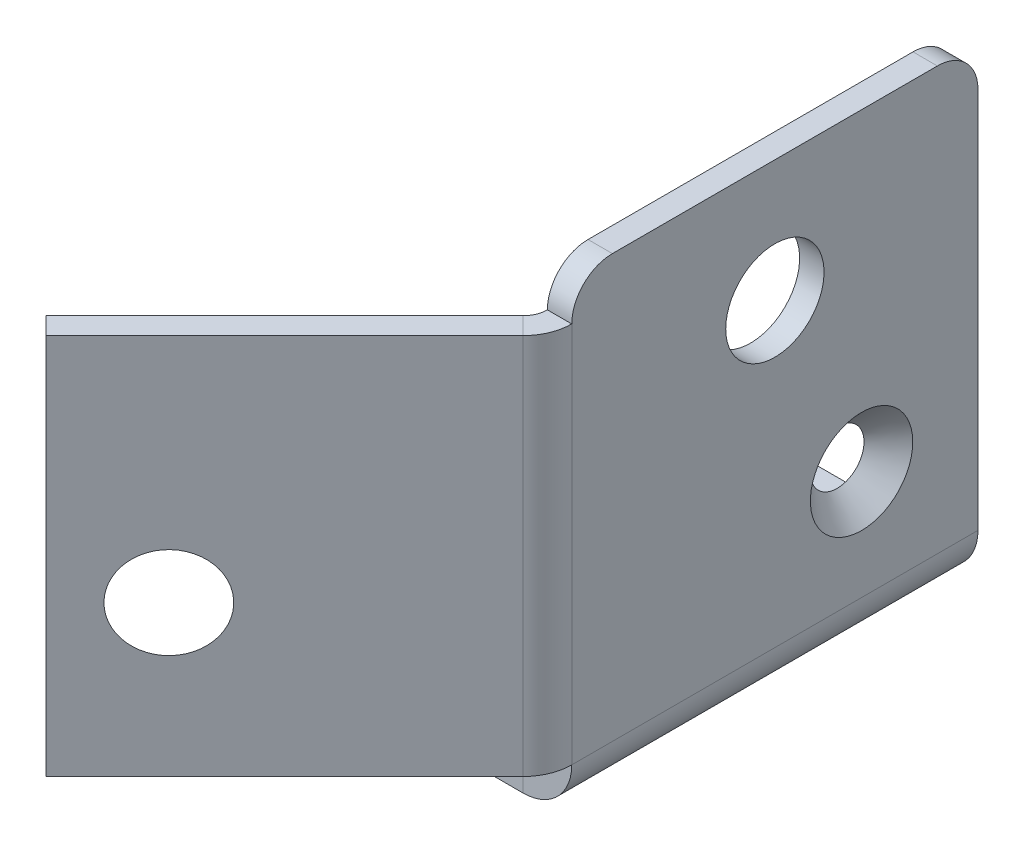
ISO-10303-21;
HEADER;
FILE_DESCRIPTION(('STEP AP214'),'2;1');
FILE_NAME('part.step','',(''),(''),'','','');
FILE_SCHEMA(('AUTOMOTIVE_DESIGN { 1 0 10303 214 1 1 1 1 }'));
ENDSEC;
DATA;
#1=APPLICATION_CONTEXT('core data for automotive mechanical design processes');
#2=APPLICATION_PROTOCOL_DEFINITION('international standard','automotive_design',2000,#1);
#3=PRODUCT_CONTEXT('',#1,'mechanical');
#4=PRODUCT('Part','Part','',(#3));
#5=PRODUCT_RELATED_PRODUCT_CATEGORY('part','',(#4));
#6=PRODUCT_DEFINITION_FORMATION('','',#4);
#7=PRODUCT_DEFINITION_CONTEXT('part definition',#1,'design');
#8=PRODUCT_DEFINITION('design','',#6,#7);
#9=PRODUCT_DEFINITION_SHAPE('','',#8);
#10=(LENGTH_UNIT() NAMED_UNIT(*) SI_UNIT(.MILLI.,.METRE.));
#11=(NAMED_UNIT(*) PLANE_ANGLE_UNIT() SI_UNIT($,.RADIAN.));
#12=(NAMED_UNIT(*) SI_UNIT($,.STERADIAN.) SOLID_ANGLE_UNIT());
#13=UNCERTAINTY_MEASURE_WITH_UNIT(LENGTH_MEASURE(1.E-05),#10,'distance_accuracy_value','');
#14=(GEOMETRIC_REPRESENTATION_CONTEXT(3) GLOBAL_UNCERTAINTY_ASSIGNED_CONTEXT((#13)) GLOBAL_UNIT_ASSIGNED_CONTEXT((#10,
#11,#12)) REPRESENTATION_CONTEXT('',''));
#15=CARTESIAN_POINT('',(0.,0.,0.));
#16=DIRECTION('',(0.,0.,1.));
#17=DIRECTION('',(1.,0.,0.));
#18=AXIS2_PLACEMENT_3D('',#15,#16,#17);
#19=CARTESIAN_POINT('',(0.,3.,50.));
#20=DIRECTION('',(0.,0.,1.));
#21=DIRECTION('',(1.,0.,0.));
#22=AXIS2_PLACEMENT_3D('',#19,#20,#21);
#23=PLANE('',#22);
#24=DIRECTION('',(1.,0.,0.));
#25=VECTOR('',#24,1.);
#26=CARTESIAN_POINT('',(0.,3.,50.));
#27=LINE('',#26,#25);
#28=CARTESIAN_POINT('',(0.,3.,50.));
#29=VERTEX_POINT('',#28);
#30=CARTESIAN_POINT('',(3.,3.,50.));
#31=VERTEX_POINT('',#30);
#32=EDGE_CURVE('E392',#29,#31,#27,.T.);
#33=ORIENTED_EDGE('',*,*,#32,.F.);
#34=CARTESIAN_POINT('',(-3.,3.,50.));
#35=DIRECTION('',(0.,0.,-1.));
#36=DIRECTION('',(-1.,0.,0.));
#37=AXIS2_PLACEMENT_3D('',#34,#35,#36);
#38=CIRCLE('',#37,3.);
#39=CARTESIAN_POINT('',(-3.,0.,50.));
#40=VERTEX_POINT('',#39);
#41=EDGE_CURVE('E318',#40,#29,#38,.F.);
#42=ORIENTED_EDGE('',*,*,#41,.F.);
#43=DIRECTION('',(0.,1.,0.));
#44=VECTOR('',#43,1.);
#45=CARTESIAN_POINT('',(-3.,-3.,50.));
#46=LINE('',#45,#44);
#47=CARTESIAN_POINT('',(-3.,-3.,50.));
#48=VERTEX_POINT('',#47);
#49=EDGE_CURVE('E388',#48,#40,#46,.T.);
#50=ORIENTED_EDGE('',*,*,#49,.F.);
#51=CARTESIAN_POINT('',(-3.,3.,50.));
#52=DIRECTION('',(0.,0.,1.));
#53=DIRECTION('',(1.,0.,0.));
#54=AXIS2_PLACEMENT_3D('',#51,#52,#53);
#55=CIRCLE('',#54,6.);
#56=EDGE_CURVE('E328',#48,#31,#55,.T.);
#57=ORIENTED_EDGE('',*,*,#56,.T.);
#58=EDGE_LOOP('',(#33,#42,#50,#57));
#59=FACE_BOUND('',#58,.T.);
#60=ADVANCED_FACE('F73',(#59),#23,.T.);
#61=CARTESIAN_POINT('',(-3.,0.,0.));
#62=DIRECTION('',(0.,0.,-1.));
#63=DIRECTION('',(-1.,0.,0.));
#64=AXIS2_PLACEMENT_3D('',#61,#62,#63);
#65=PLANE('',#64);
#66=DIRECTION('',(0.,-1.,0.));
#67=VECTOR('',#66,1.);
#68=CARTESIAN_POINT('',(-3.,0.,0.));
#69=LINE('',#68,#67);
#70=CARTESIAN_POINT('',(-3.,0.,0.));
#71=VERTEX_POINT('',#70);
#72=CARTESIAN_POINT('',(-3.,-3.,0.));
#73=VERTEX_POINT('',#72);
#74=EDGE_CURVE('E384',#71,#73,#69,.T.);
#75=ORIENTED_EDGE('',*,*,#74,.F.);
#76=CARTESIAN_POINT('',(-3.,3.,0.));
#77=DIRECTION('',(0.,0.,-1.));
#78=DIRECTION('',(-1.,0.,0.));
#79=AXIS2_PLACEMENT_3D('',#76,#77,#78);
#80=CIRCLE('',#79,3.);
#81=CARTESIAN_POINT('',(0.,3.,0.));
#82=VERTEX_POINT('',#81);
#83=EDGE_CURVE('E338',#71,#82,#80,.F.);
#84=ORIENTED_EDGE('',*,*,#83,.T.);
#85=DIRECTION('',(-1.,0.,0.));
#86=VECTOR('',#85,1.);
#87=CARTESIAN_POINT('',(3.,3.,0.));
#88=LINE('',#87,#86);
#89=CARTESIAN_POINT('',(3.,3.,0.));
#90=VERTEX_POINT('',#89);
#91=EDGE_CURVE('E381',#90,#82,#88,.T.);
#92=ORIENTED_EDGE('',*,*,#91,.F.);
#93=CARTESIAN_POINT('',(-3.,3.,0.));
#94=DIRECTION('',(0.,0.,1.));
#95=DIRECTION('',(1.,0.,0.));
#96=AXIS2_PLACEMENT_3D('',#93,#94,#95);
#97=CIRCLE('',#96,6.);
#98=EDGE_CURVE('E315',#73,#90,#97,.T.);
#99=ORIENTED_EDGE('',*,*,#98,.F.);
#100=EDGE_LOOP('',(#75,#84,#92,#99));
#101=FACE_BOUND('',#100,.T.);
#102=ADVANCED_FACE('F460',(#101),#65,.T.);
#103=CARTESIAN_POINT('',(3.,3.,0.));
#104=DIRECTION('',(0.,0.,-1.));
#105=DIRECTION('',(-1.,0.,0.));
#106=AXIS2_PLACEMENT_3D('',#103,#104,#105);
#107=PLANE('',#106);
#108=DIRECTION('',(1.,0.,0.));
#109=VECTOR('',#108,1.);
#110=CARTESIAN_POINT('',(0.,-3.,0.));
#111=LINE('',#110,#109);
#112=CARTESIAN_POINT('',(-25.,-3.,0.));
#113=VERTEX_POINT('',#112);
#114=EDGE_CURVE('E345',#113,#73,#111,.T.);
#115=ORIENTED_EDGE('',*,*,#114,.F.);
#116=DIRECTION('',(0.,1.,0.));
#117=VECTOR('',#116,1.);
#118=CARTESIAN_POINT('',(-25.,3.,0.));
#119=LINE('',#118,#117);
#120=CARTESIAN_POINT('',(-25.,0.,0.));
#121=VERTEX_POINT('',#120);
#122=EDGE_CURVE('E82',#113,#121,#119,.T.);
#123=ORIENTED_EDGE('',*,*,#122,.T.);
#124=DIRECTION('',(1.,0.,0.));
#125=VECTOR('',#124,1.);
#126=CARTESIAN_POINT('',(0.,0.,0.));
#127=LINE('',#126,#125);
#128=EDGE_CURVE('E342',#121,#71,#127,.T.);
#129=ORIENTED_EDGE('',*,*,#128,.T.);
#130=ORIENTED_EDGE('',*,*,#74,.T.);
#131=EDGE_LOOP('',(#115,#123,#129,#130));
#132=FACE_BOUND('',#131,.T.);
#133=ADVANCED_FACE('F446',(#132),#107,.T.);
#134=CARTESIAN_POINT('',(3.,0.,50.));
#135=DIRECTION('',(-1.,0.,0.));
#136=DIRECTION('',(0.,0.,1.));
#137=AXIS2_PLACEMENT_3D('',#134,#135,#136);
#138=PLANE('',#137);
#139=CARTESIAN_POINT('',(3.,16.4388147831113,14.3300473282855));
#140=DIRECTION('',(1.,0.,0.));
#141=DIRECTION('',(0.,0.,-1.));
#142=AXIS2_PLACEMENT_3D('',#139,#140,#141);
#143=CIRCLE('',#142,6.3);
#144=CARTESIAN_POINT('',(3.,16.4388147831113,8.03004732828552));
#145=VERTEX_POINT('',#144);
#146=EDGE_CURVE('E591',#145,#145,#143,.T.);
#147=ORIENTED_EDGE('',*,*,#146,.F.);
#148=EDGE_LOOP('',(#147));
#149=FACE_BOUND('',#148,.T.);
#150=CARTESIAN_POINT('',(3.,40.,25.));
#151=DIRECTION('',(-1.,0.,0.));
#152=DIRECTION('',(0.,0.,1.));
#153=AXIS2_PLACEMENT_3D('',#150,#151,#152);
#154=CIRCLE('',#153,6.04999999999999);
#155=CARTESIAN_POINT('',(3.,40.,31.05));
#156=VERTEX_POINT('',#155);
#157=EDGE_CURVE('E306',#156,#156,#154,.T.);
#158=ORIENTED_EDGE('',*,*,#157,.T.);
#159=EDGE_LOOP('',(#158));
#160=FACE_BOUND('',#159,.T.);
#161=DIRECTION('',(0.,0.,-1.));
#162=VECTOR('',#161,1.);
#163=CARTESIAN_POINT('',(3.,55.,50.));
#164=LINE('',#163,#162);
#165=CARTESIAN_POINT('',(3.,55.,45.));
#166=VERTEX_POINT('',#165);
#167=CARTESIAN_POINT('',(3.,55.,5.));
#168=VERTEX_POINT('',#167);
#169=EDGE_CURVE('E377',#166,#168,#164,.T.);
#170=ORIENTED_EDGE('',*,*,#169,.F.);
#171=CARTESIAN_POINT('',(3.,50.,45.));
#172=DIRECTION('',(-1.,0.,0.));
#173=DIRECTION('',(0.,0.,1.));
#174=AXIS2_PLACEMENT_3D('',#171,#172,#173);
#175=CIRCLE('',#174,5.);
#176=CARTESIAN_POINT('',(3.,50.,50.));
#177=VERTEX_POINT('',#176);
#178=EDGE_CURVE('E428',#166,#177,#175,.F.);
#179=ORIENTED_EDGE('',*,*,#178,.T.);
#180=DIRECTION('',(0.,1.,0.));
#181=VECTOR('',#180,1.);
#182=CARTESIAN_POINT('',(3.,0.,50.));
#183=LINE('',#182,#181);
#184=EDGE_CURVE('E311',#31,#177,#183,.T.);
#185=ORIENTED_EDGE('',*,*,#184,.F.);
#186=DIRECTION('',(0.,0.,-1.));
#187=VECTOR('',#186,1.);
#188=CARTESIAN_POINT('',(3.,3.,50.));
#189=LINE('',#188,#187);
#190=EDGE_CURVE('E331',#31,#90,#189,.T.);
#191=ORIENTED_EDGE('',*,*,#190,.T.);
#192=DIRECTION('',(0.,1.,0.));
#193=VECTOR('',#192,1.);
#194=CARTESIAN_POINT('',(3.,0.,0.));
#195=LINE('',#194,#193);
#196=CARTESIAN_POINT('',(3.,50.,0.));
#197=VERTEX_POINT('',#196);
#198=EDGE_CURVE('E310',#90,#197,#195,.T.);
#199=ORIENTED_EDGE('',*,*,#198,.T.);
#200=CARTESIAN_POINT('',(3.,50.,5.));
#201=DIRECTION('',(-1.,0.,0.));
#202=DIRECTION('',(0.,0.,1.));
#203=AXIS2_PLACEMENT_3D('',#200,#201,#202);
#204=CIRCLE('',#203,5.);
#205=EDGE_CURVE('E425',#197,#168,#204,.F.);
#206=ORIENTED_EDGE('',*,*,#205,.T.);
#207=EDGE_LOOP('',(#170,#179,#185,#191,#199,#206));
#208=FACE_BOUND('',#207,.T.);
#209=ADVANCED_FACE('F510',(#149,#160,#208),#138,.F.);
#210=CARTESIAN_POINT('',(0.,55.,50.));
#211=DIRECTION('',(0.,1.,0.));
#212=DIRECTION('',(0.,0.,1.));
#213=AXIS2_PLACEMENT_3D('',#210,#211,#212);
#214=PLANE('',#213);
#215=DIRECTION('',(0.,0.,-1.));
#216=VECTOR('',#215,1.);
#217=CARTESIAN_POINT('',(0.,55.,50.));
#218=LINE('',#217,#216);
#219=CARTESIAN_POINT('',(0.,55.,45.));
#220=VERTEX_POINT('',#219);
#221=CARTESIAN_POINT('',(0.,55.,5.));
#222=VERTEX_POINT('',#221);
#223=EDGE_CURVE('E374',#220,#222,#218,.T.);
#224=ORIENTED_EDGE('',*,*,#223,.F.);
#225=DIRECTION('',(1.,0.,0.));
#226=VECTOR('',#225,1.);
#227=CARTESIAN_POINT('',(0.,55.,45.));
#228=LINE('',#227,#226);
#229=EDGE_CURVE('E421',#220,#166,#228,.T.);
#230=ORIENTED_EDGE('',*,*,#229,.T.);
#231=ORIENTED_EDGE('',*,*,#169,.T.);
#232=DIRECTION('',(1.,0.,0.));
#233=VECTOR('',#232,1.);
#234=CARTESIAN_POINT('',(0.,55.,5.));
#235=LINE('',#234,#233);
#236=EDGE_CURVE('E418',#168,#222,#235,.F.);
#237=ORIENTED_EDGE('',*,*,#236,.T.);
#238=EDGE_LOOP('',(#224,#230,#231,#237));
#239=FACE_BOUND('',#238,.T.);
#240=ADVANCED_FACE('F513',(#239),#214,.T.);
#241=CARTESIAN_POINT('',(0.,0.,50.));
#242=DIRECTION('',(-1.,0.,0.));
#243=DIRECTION('',(0.,0.,1.));
#244=AXIS2_PLACEMENT_3D('',#241,#242,#243);
#245=PLANE('',#244);
#246=CARTESIAN_POINT('',(0.,16.4388147831113,14.3300473282855));
#247=DIRECTION('',(1.,0.,0.));
#248=DIRECTION('',(0.,0.,-1.));
#249=AXIS2_PLACEMENT_3D('',#246,#247,#248);
#250=CIRCLE('',#249,3.3);
#251=CARTESIAN_POINT('',(0.,16.4388147831113,11.0300473282855));
#252=VERTEX_POINT('',#251);
#253=EDGE_CURVE('E588',#252,#252,#250,.T.);
#254=ORIENTED_EDGE('',*,*,#253,.T.);
#255=EDGE_LOOP('',(#254));
#256=FACE_BOUND('',#255,.T.);
#257=CARTESIAN_POINT('',(0.,40.,25.));
#258=DIRECTION('',(-1.,0.,0.));
#259=DIRECTION('',(0.,0.,1.));
#260=AXIS2_PLACEMENT_3D('',#257,#258,#259);
#261=CIRCLE('',#260,6.05);
#262=CARTESIAN_POINT('',(0.,40.,31.05));
#263=VERTEX_POINT('',#262);
#264=EDGE_CURVE('E302',#263,#263,#261,.T.);
#265=ORIENTED_EDGE('',*,*,#264,.F.);
#266=EDGE_LOOP('',(#265));
#267=FACE_BOUND('',#266,.T.);
#268=DIRECTION('',(0.,1.,0.));
#269=VECTOR('',#268,1.);
#270=CARTESIAN_POINT('',(0.,0.,50.));
#271=LINE('',#270,#269);
#272=CARTESIAN_POINT('',(0.,50.,50.));
#273=VERTEX_POINT('',#272);
#274=EDGE_CURVE('E102',#29,#273,#271,.T.);
#275=ORIENTED_EDGE('',*,*,#274,.T.);
#276=CARTESIAN_POINT('',(0.,50.,45.));
#277=DIRECTION('',(-1.,0.,0.));
#278=DIRECTION('',(0.,0.,1.));
#279=AXIS2_PLACEMENT_3D('',#276,#277,#278);
#280=CIRCLE('',#279,5.);
#281=EDGE_CURVE('E438',#273,#220,#280,.T.);
#282=ORIENTED_EDGE('',*,*,#281,.T.);
#283=ORIENTED_EDGE('',*,*,#223,.T.);
#284=CARTESIAN_POINT('',(0.,50.,5.));
#285=DIRECTION('',(-1.,0.,0.));
#286=DIRECTION('',(0.,0.,1.));
#287=AXIS2_PLACEMENT_3D('',#284,#285,#286);
#288=CIRCLE('',#287,5.);
#289=CARTESIAN_POINT('',(0.,50.,0.));
#290=VERTEX_POINT('',#289);
#291=EDGE_CURVE('E92',#222,#290,#288,.T.);
#292=ORIENTED_EDGE('',*,*,#291,.T.);
#293=DIRECTION('',(0.,1.,0.));
#294=VECTOR('',#293,1.);
#295=CARTESIAN_POINT('',(0.,0.,0.));
#296=LINE('',#295,#294);
#297=EDGE_CURVE('E335',#82,#290,#296,.T.);
#298=ORIENTED_EDGE('',*,*,#297,.F.);
#299=DIRECTION('',(0.,0.,-1.));
#300=VECTOR('',#299,1.);
#301=CARTESIAN_POINT('',(0.,3.,50.));
#302=LINE('',#301,#300);
#303=EDGE_CURVE('E370',#29,#82,#302,.T.);
#304=ORIENTED_EDGE('',*,*,#303,.F.);
#305=EDGE_LOOP('',(#275,#282,#283,#292,#298,#304));
#306=FACE_BOUND('',#305,.T.);
#307=ADVANCED_FACE('F517',(#256,#267,#306),#245,.T.);
#308=CARTESIAN_POINT('',(-3.,3.,50.));
#309=DIRECTION('',(0.,0.,-1.));
#310=DIRECTION('',(-1.,0.,0.));
#311=AXIS2_PLACEMENT_3D('',#308,#309,#310);
#312=CYLINDRICAL_SURFACE('',#311,3.);
#313=ORIENTED_EDGE('',*,*,#83,.F.);
#314=DIRECTION('',(0.,0.,-1.));
#315=VECTOR('',#314,1.);
#316=CARTESIAN_POINT('',(-3.,0.,50.));
#317=LINE('',#316,#315);
#318=EDGE_CURVE('E366',#40,#71,#317,.T.);
#319=ORIENTED_EDGE('',*,*,#318,.F.);
#320=ORIENTED_EDGE('',*,*,#41,.T.);
#321=ORIENTED_EDGE('',*,*,#303,.T.);
#322=EDGE_LOOP('',(#313,#319,#320,#321));
#323=FACE_BOUND('',#322,.T.);
#324=ADVANCED_FACE('F458',(#323),#312,.F.);
#325=CARTESIAN_POINT('',(0.,0.,50.));
#326=DIRECTION('',(0.,1.,0.));
#327=DIRECTION('',(0.,0.,1.));
#328=AXIS2_PLACEMENT_3D('',#325,#326,#327);
#329=PLANE('',#328);
#330=CARTESIAN_POINT('',(-16.5,0.,40.));
#331=DIRECTION('',(0.,1.,0.));
#332=DIRECTION('',(0.,0.,1.));
#333=AXIS2_PLACEMENT_3D('',#330,#331,#332);
#334=CIRCLE('',#333,3.3);
#335=CARTESIAN_POINT('',(-16.5,0.,43.3));
#336=VERTEX_POINT('',#335);
#337=EDGE_CURVE('E274',#336,#336,#334,.T.);
#338=ORIENTED_EDGE('',*,*,#337,.F.);
#339=EDGE_LOOP('',(#338));
#340=FACE_BOUND('',#339,.T.);
#341=CARTESIAN_POINT('',(-16.5,0.,10.));
#342=DIRECTION('',(0.,1.,0.));
#343=DIRECTION('',(0.,0.,1.));
#344=AXIS2_PLACEMENT_3D('',#341,#342,#343);
#345=CIRCLE('',#344,3.3);
#346=CARTESIAN_POINT('',(-16.5,0.,13.3));
#347=VERTEX_POINT('',#346);
#348=EDGE_CURVE('E294',#347,#347,#345,.T.);
#349=ORIENTED_EDGE('',*,*,#348,.F.);
#350=EDGE_LOOP('',(#349));
#351=FACE_BOUND('',#350,.T.);
#352=DIRECTION('',(0.,0.,-1.));
#353=VECTOR('',#352,1.);
#354=CARTESIAN_POINT('',(-30.,0.,50.));
#355=LINE('',#354,#353);
#356=CARTESIAN_POINT('',(-30.,0.,45.));
#357=VERTEX_POINT('',#356);
#358=CARTESIAN_POINT('',(-30.,0.,5.));
#359=VERTEX_POINT('',#358);
#360=EDGE_CURVE('E362',#357,#359,#355,.T.);
#361=ORIENTED_EDGE('',*,*,#360,.F.);
#362=CARTESIAN_POINT('',(-25.,0.,45.));
#363=DIRECTION('',(0.,1.,0.));
#364=DIRECTION('',(0.,0.,1.));
#365=AXIS2_PLACEMENT_3D('',#362,#363,#364);
#366=CIRCLE('',#365,5.);
#367=CARTESIAN_POINT('',(-25.,0.,50.));
#368=VERTEX_POINT('',#367);
#369=EDGE_CURVE('E406',#357,#368,#366,.T.);
#370=ORIENTED_EDGE('',*,*,#369,.T.);
#371=DIRECTION('',(1.,0.,0.));
#372=VECTOR('',#371,1.);
#373=CARTESIAN_POINT('',(0.,0.,50.));
#374=LINE('',#373,#372);
#375=EDGE_CURVE('E322',#368,#40,#374,.T.);
#376=ORIENTED_EDGE('',*,*,#375,.T.);
#377=ORIENTED_EDGE('',*,*,#318,.T.);
#378=ORIENTED_EDGE('',*,*,#128,.F.);
#379=CARTESIAN_POINT('',(-25.,0.,5.));
#380=DIRECTION('',(0.,1.,0.));
#381=DIRECTION('',(0.,0.,1.));
#382=AXIS2_PLACEMENT_3D('',#379,#380,#381);
#383=CIRCLE('',#382,5.);
#384=EDGE_CURVE('E403',#121,#359,#383,.T.);
#385=ORIENTED_EDGE('',*,*,#384,.T.);
#386=EDGE_LOOP('',(#361,#370,#376,#377,#378,#385));
#387=FACE_BOUND('',#386,.T.);
#388=ADVANCED_FACE('F452',(#340,#351,#387),#329,.T.);
#389=CARTESIAN_POINT('',(-30.,-3.,50.));
#390=DIRECTION('',(-1.,0.,0.));
#391=DIRECTION('',(0.,0.,1.));
#392=AXIS2_PLACEMENT_3D('',#389,#390,#391);
#393=PLANE('',#392);
#394=DIRECTION('',(0.,0.,-1.));
#395=VECTOR('',#394,1.);
#396=CARTESIAN_POINT('',(-30.,-3.,50.));
#397=LINE('',#396,#395);
#398=CARTESIAN_POINT('',(-30.,-3.,45.));
#399=VERTEX_POINT('',#398);
#400=CARTESIAN_POINT('',(-30.,-3.,5.));
#401=VERTEX_POINT('',#400);
#402=EDGE_CURVE('E358',#399,#401,#397,.T.);
#403=ORIENTED_EDGE('',*,*,#402,.F.);
#404=DIRECTION('',(0.,1.,0.));
#405=VECTOR('',#404,1.);
#406=CARTESIAN_POINT('',(-30.,0.,45.));
#407=LINE('',#406,#405);
#408=EDGE_CURVE('E399',#399,#357,#407,.T.);
#409=ORIENTED_EDGE('',*,*,#408,.T.);
#410=ORIENTED_EDGE('',*,*,#360,.T.);
#411=DIRECTION('',(0.,1.,0.));
#412=VECTOR('',#411,1.);
#413=CARTESIAN_POINT('',(-30.,-3.,5.));
#414=LINE('',#413,#412);
#415=EDGE_CURVE('E396',#359,#401,#414,.F.);
#416=ORIENTED_EDGE('',*,*,#415,.T.);
#417=EDGE_LOOP('',(#403,#409,#410,#416));
#418=FACE_BOUND('',#417,.T.);
#419=ADVANCED_FACE('F475',(#418),#393,.T.);
#420=CARTESIAN_POINT('',(0.,-3.,50.));
#421=DIRECTION('',(0.,1.,0.));
#422=DIRECTION('',(0.,0.,1.));
#423=AXIS2_PLACEMENT_3D('',#420,#421,#422);
#424=PLANE('',#423);
#425=CARTESIAN_POINT('',(-16.5,-3.,40.));
#426=DIRECTION('',(0.,1.,0.));
#427=DIRECTION('',(0.,0.,1.));
#428=AXIS2_PLACEMENT_3D('',#425,#426,#427);
#429=CIRCLE('',#428,3.3);
#430=CARTESIAN_POINT('',(-16.5,-3.,43.3));
#431=VERTEX_POINT('',#430);
#432=EDGE_CURVE('E290',#431,#431,#429,.T.);
#433=ORIENTED_EDGE('',*,*,#432,.T.);
#434=EDGE_LOOP('',(#433));
#435=FACE_BOUND('',#434,.T.);
#436=CARTESIAN_POINT('',(-16.5,-3.,10.));
#437=DIRECTION('',(0.,1.,0.));
#438=DIRECTION('',(0.,0.,1.));
#439=AXIS2_PLACEMENT_3D('',#436,#437,#438);
#440=CIRCLE('',#439,3.3);
#441=CARTESIAN_POINT('',(-16.5,-3.,13.3));
#442=VERTEX_POINT('',#441);
#443=EDGE_CURVE('E298',#442,#442,#440,.T.);
#444=ORIENTED_EDGE('',*,*,#443,.T.);
#445=EDGE_LOOP('',(#444));
#446=FACE_BOUND('',#445,.T.);
#447=DIRECTION('',(1.,0.,0.));
#448=VECTOR('',#447,1.);
#449=CARTESIAN_POINT('',(0.,-3.,50.));
#450=LINE('',#449,#448);
#451=CARTESIAN_POINT('',(-25.,-3.,50.));
#452=VERTEX_POINT('',#451);
#453=EDGE_CURVE('E325',#452,#48,#450,.T.);
#454=ORIENTED_EDGE('',*,*,#453,.F.);
#455=CARTESIAN_POINT('',(-25.,-3.,45.));
#456=DIRECTION('',(0.,1.,0.));
#457=DIRECTION('',(0.,0.,1.));
#458=AXIS2_PLACEMENT_3D('',#455,#456,#457);
#459=CIRCLE('',#458,5.);
#460=EDGE_CURVE('E415',#452,#399,#459,.F.);
#461=ORIENTED_EDGE('',*,*,#460,.T.);
#462=ORIENTED_EDGE('',*,*,#402,.T.);
#463=CARTESIAN_POINT('',(-25.,-3.,5.));
#464=DIRECTION('',(0.,1.,0.));
#465=DIRECTION('',(0.,0.,1.));
#466=AXIS2_PLACEMENT_3D('',#463,#464,#465);
#467=CIRCLE('',#466,5.);
#468=EDGE_CURVE('E412',#401,#113,#467,.F.);
#469=ORIENTED_EDGE('',*,*,#468,.T.);
#470=ORIENTED_EDGE('',*,*,#114,.T.);
#471=DIRECTION('',(0.,0.,-1.));
#472=VECTOR('',#471,1.);
#473=CARTESIAN_POINT('',(-3.,-3.,50.));
#474=LINE('',#473,#472);
#475=EDGE_CURVE('E354',#48,#73,#474,.T.);
#476=ORIENTED_EDGE('',*,*,#475,.F.);
#477=EDGE_LOOP('',(#454,#461,#462,#469,#470,#476));
#478=FACE_BOUND('',#477,.T.);
#479=ADVANCED_FACE('F469',(#435,#446,#478),#424,.F.);
#480=CARTESIAN_POINT('',(-3.,3.,50.));
#481=DIRECTION('',(0.,0.,-1.));
#482=DIRECTION('',(-1.,0.,0.));
#483=AXIS2_PLACEMENT_3D('',#480,#481,#482);
#484=CYLINDRICAL_SURFACE('',#483,6.);
#485=ORIENTED_EDGE('',*,*,#98,.T.);
#486=ORIENTED_EDGE('',*,*,#190,.F.);
#487=ORIENTED_EDGE('',*,*,#56,.F.);
#488=ORIENTED_EDGE('',*,*,#475,.T.);
#489=EDGE_LOOP('',(#485,#486,#487,#488));
#490=FACE_BOUND('',#489,.T.);
#491=ADVANCED_FACE('F465',(#490),#484,.T.);
#492=CARTESIAN_POINT('',(-3.,3.,50.));
#493=DIRECTION('',(0.,0.,-1.));
#494=DIRECTION('',(-1.,0.,0.));
#495=AXIS2_PLACEMENT_3D('',#492,#493,#494);
#496=PLANE('',#495);
#497=ORIENTED_EDGE('',*,*,#375,.F.);
#498=DIRECTION('',(0.,1.,0.));
#499=VECTOR('',#498,1.);
#500=CARTESIAN_POINT('',(-25.,-3.,50.));
#501=LINE('',#500,#499);
#502=EDGE_CURVE('E409',#368,#452,#501,.F.);
#503=ORIENTED_EDGE('',*,*,#502,.T.);
#504=ORIENTED_EDGE('',*,*,#453,.T.);
#505=ORIENTED_EDGE('',*,*,#49,.T.);
#506=EDGE_LOOP('',(#497,#503,#504,#505));
#507=FACE_BOUND('',#506,.T.);
#508=ADVANCED_FACE('F480',(#507),#496,.F.);
#509=CARTESIAN_POINT('',(-3.,3.,0.));
#510=DIRECTION('',(0.,0.,-1.));
#511=DIRECTION('',(-1.,0.,0.));
#512=AXIS2_PLACEMENT_3D('',#509,#510,#511);
#513=PLANE('',#512);
#514=ORIENTED_EDGE('',*,*,#297,.T.);
#515=DIRECTION('',(1.,0.,0.));
#516=VECTOR('',#515,1.);
#517=CARTESIAN_POINT('',(-3.,50.,0.));
#518=LINE('',#517,#516);
#519=EDGE_CURVE('E13',#290,#197,#518,.T.);
#520=ORIENTED_EDGE('',*,*,#519,.T.);
#521=ORIENTED_EDGE('',*,*,#198,.F.);
#522=ORIENTED_EDGE('',*,*,#91,.T.);
#523=EDGE_LOOP('',(#514,#520,#521,#522));
#524=FACE_BOUND('',#523,.T.);
#525=ADVANCED_FACE('F533',(#524),#513,.T.);
#526=CARTESIAN_POINT('',(0.,40.,25.));
#527=DIRECTION('',(-1.,0.,0.));
#528=DIRECTION('',(0.,0.,1.));
#529=AXIS2_PLACEMENT_3D('',#526,#527,#528);
#530=CYLINDRICAL_SURFACE('',#529,6.05);
#531=ORIENTED_EDGE('',*,*,#157,.F.);
#532=EDGE_LOOP('',(#531));
#533=FACE_BOUND('',#532,.T.);
#534=ORIENTED_EDGE('',*,*,#264,.T.);
#535=EDGE_LOOP('',(#534));
#536=FACE_BOUND('',#535,.T.);
#537=ADVANCED_FACE('F535',(#533,#536),#530,.F.);
#538=CARTESIAN_POINT('',(-16.5,0.,10.));
#539=DIRECTION('',(0.,1.,0.));
#540=DIRECTION('',(0.,0.,1.));
#541=AXIS2_PLACEMENT_3D('',#538,#539,#540);
#542=CYLINDRICAL_SURFACE('',#541,3.3);
#543=ORIENTED_EDGE('',*,*,#443,.F.);
#544=EDGE_LOOP('',(#543));
#545=FACE_BOUND('',#544,.T.);
#546=ORIENTED_EDGE('',*,*,#348,.T.);
#547=EDGE_LOOP('',(#546));
#548=FACE_BOUND('',#547,.T.);
#549=ADVANCED_FACE('F495',(#545,#548),#542,.F.);
#550=CARTESIAN_POINT('',(-16.5,0.,40.));
#551=DIRECTION('',(0.,1.,0.));
#552=DIRECTION('',(0.,0.,1.));
#553=AXIS2_PLACEMENT_3D('',#550,#551,#552);
#554=CYLINDRICAL_SURFACE('',#553,3.3);
#555=ORIENTED_EDGE('',*,*,#432,.F.);
#556=EDGE_LOOP('',(#555));
#557=FACE_BOUND('',#556,.T.);
#558=ORIENTED_EDGE('',*,*,#337,.T.);
#559=EDGE_LOOP('',(#558));
#560=FACE_BOUND('',#559,.T.);
#561=ADVANCED_FACE('F485',(#557,#560),#554,.F.);
#562=CARTESIAN_POINT('',(-25.,-3.,45.));
#563=DIRECTION('',(0.,-1.,0.));
#564=DIRECTION('',(0.,0.,-1.));
#565=AXIS2_PLACEMENT_3D('',#562,#563,#564);
#566=CYLINDRICAL_SURFACE('',#565,5.);
#567=ORIENTED_EDGE('',*,*,#460,.F.);
#568=ORIENTED_EDGE('',*,*,#502,.F.);
#569=ORIENTED_EDGE('',*,*,#369,.F.);
#570=ORIENTED_EDGE('',*,*,#408,.F.);
#571=EDGE_LOOP('',(#567,#568,#569,#570));
#572=FACE_BOUND('',#571,.T.);
#573=ADVANCED_FACE('F482',(#572),#566,.T.);
#574=CARTESIAN_POINT('',(0.,50.,45.));
#575=DIRECTION('',(1.,0.,0.));
#576=DIRECTION('',(0.,0.,-1.));
#577=AXIS2_PLACEMENT_3D('',#574,#575,#576);
#578=CYLINDRICAL_SURFACE('',#577,5.);
#579=ORIENTED_EDGE('',*,*,#281,.F.);
#580=DIRECTION('',(1.,0.,0.));
#581=VECTOR('',#580,1.);
#582=CARTESIAN_POINT('',(-3.,50.,50.));
#583=LINE('',#582,#581);
#584=EDGE_CURVE('E432',#177,#273,#583,.F.);
#585=ORIENTED_EDGE('',*,*,#584,.F.);
#586=ORIENTED_EDGE('',*,*,#178,.F.);
#587=ORIENTED_EDGE('',*,*,#229,.F.);
#588=EDGE_LOOP('',(#579,#585,#586,#587));
#589=FACE_BOUND('',#588,.T.);
#590=ADVANCED_FACE('F484',(#589),#578,.T.);
#591=CARTESIAN_POINT('',(-25.,3.,5.));
#592=DIRECTION('',(0.,1.,0.));
#593=DIRECTION('',(0.,0.,1.));
#594=AXIS2_PLACEMENT_3D('',#591,#592,#593);
#595=CYLINDRICAL_SURFACE('',#594,5.);
#596=ORIENTED_EDGE('',*,*,#468,.F.);
#597=ORIENTED_EDGE('',*,*,#415,.F.);
#598=ORIENTED_EDGE('',*,*,#384,.F.);
#599=ORIENTED_EDGE('',*,*,#122,.F.);
#600=EDGE_LOOP('',(#596,#597,#598,#599));
#601=FACE_BOUND('',#600,.T.);
#602=ADVANCED_FACE('F473',(#601),#595,.T.);
#603=CARTESIAN_POINT('',(-3.,50.,5.));
#604=DIRECTION('',(1.,0.,0.));
#605=DIRECTION('',(0.,0.,-1.));
#606=AXIS2_PLACEMENT_3D('',#603,#604,#605);
#607=CYLINDRICAL_SURFACE('',#606,5.);
#608=ORIENTED_EDGE('',*,*,#291,.F.);
#609=ORIENTED_EDGE('',*,*,#236,.F.);
#610=ORIENTED_EDGE('',*,*,#205,.F.);
#611=ORIENTED_EDGE('',*,*,#519,.F.);
#612=EDGE_LOOP('',(#608,#609,#610,#611));
#613=FACE_BOUND('',#612,.T.);
#614=ADVANCED_FACE('F75',(#613),#607,.T.);
#615=CARTESIAN_POINT('',(-3.00000000000001,3.00000000000001,50.));
#616=DIRECTION('',(0.,-1.,0.));
#617=DIRECTION('',(1.,0.,0.));
#618=AXIS2_PLACEMENT_3D('',#615,#616,#617);
#619=PLANE('',#618);
#620=DIRECTION('',(-0.707106781186551,0.,-0.707106781186544));
#621=VECTOR('',#620,1.);
#622=CARTESIAN_POINT('',(1.24264068711931,3.,54.2426406871193));
#623=LINE('',#622,#621);
#624=CARTESIAN_POINT('',(-0.878679656440354,3.00000000000001,52.1213203435596));
#625=VERTEX_POINT('',#624);
#626=CARTESIAN_POINT('',(1.2426406871193,3.00000000000002,54.2426406871193));
#627=VERTEX_POINT('',#626);
#628=EDGE_CURVE('E243',#625,#627,#623,.F.);
#629=ORIENTED_EDGE('',*,*,#628,.F.);
#630=CARTESIAN_POINT('',(-3.00000000000001,3.00000000000001,50.));
#631=DIRECTION('',(0.,1.,0.));
#632=DIRECTION('',(-1.,0.,0.));
#633=AXIS2_PLACEMENT_3D('',#630,#631,#632);
#634=CIRCLE('',#633,3.);
#635=EDGE_CURVE('E279',#29,#625,#634,.F.);
#636=ORIENTED_EDGE('',*,*,#635,.F.);
#637=ORIENTED_EDGE('',*,*,#32,.T.);
#638=CARTESIAN_POINT('',(-3.00000000000001,3.00000000000002,50.));
#639=DIRECTION('',(0.,1.,0.));
#640=DIRECTION('',(-1.,0.,0.));
#641=AXIS2_PLACEMENT_3D('',#638,#639,#640);
#642=CIRCLE('',#641,6.);
#643=EDGE_CURVE('E270',#31,#627,#642,.F.);
#644=ORIENTED_EDGE('',*,*,#643,.T.);
#645=EDGE_LOOP('',(#629,#636,#637,#644));
#646=FACE_BOUND('',#645,.T.);
#647=ADVANCED_FACE('F549',(#646),#619,.T.);
#648=CARTESIAN_POINT('',(-3.,50.,50.));
#649=DIRECTION('',(0.,-1.,0.));
#650=DIRECTION('',(1.,0.,0.));
#651=AXIS2_PLACEMENT_3D('',#648,#649,#650);
#652=PLANE('',#651);
#653=CARTESIAN_POINT('',(-3.,50.,50.));
#654=DIRECTION('',(0.,1.,0.));
#655=DIRECTION('',(-1.,0.,0.));
#656=AXIS2_PLACEMENT_3D('',#653,#654,#655);
#657=CIRCLE('',#656,3.);
#658=CARTESIAN_POINT('',(-0.878679656440347,50.,52.1213203435596));
#659=VERTEX_POINT('',#658);
#660=EDGE_CURVE('E283',#659,#273,#657,.T.);
#661=ORIENTED_EDGE('',*,*,#660,.F.);
#662=DIRECTION('',(-0.707106781186551,0.,-0.707106781186544));
#663=VECTOR('',#662,1.);
#664=CARTESIAN_POINT('',(-0.878679656440347,50.,52.1213203435596));
#665=LINE('',#664,#663);
#666=CARTESIAN_POINT('',(1.2426406871193,50.,54.2426406871193));
#667=VERTEX_POINT('',#666);
#668=EDGE_CURVE('E260',#659,#667,#665,.F.);
#669=ORIENTED_EDGE('',*,*,#668,.T.);
#670=CARTESIAN_POINT('',(-3.,50.,50.));
#671=DIRECTION('',(0.,1.,0.));
#672=DIRECTION('',(-1.,0.,0.));
#673=AXIS2_PLACEMENT_3D('',#670,#671,#672);
#674=CIRCLE('',#673,6.);
#675=EDGE_CURVE('E275',#667,#177,#674,.T.);
#676=ORIENTED_EDGE('',*,*,#675,.T.);
#677=ORIENTED_EDGE('',*,*,#584,.T.);
#678=EDGE_LOOP('',(#661,#669,#676,#677));
#679=FACE_BOUND('',#678,.T.);
#680=ADVANCED_FACE('F545',(#679),#652,.F.);
#681=CARTESIAN_POINT('',(-3.,50.,50.));
#682=DIRECTION('',(0.,1.,0.));
#683=DIRECTION('',(0.707106781186551,0.,0.707106781186544));
#684=AXIS2_PLACEMENT_3D('',#681,#682,#683);
#685=CYLINDRICAL_SURFACE('',#684,6.);
#686=ORIENTED_EDGE('',*,*,#184,.T.);
#687=ORIENTED_EDGE('',*,*,#675,.F.);
#688=DIRECTION('',(0.,1.,0.));
#689=VECTOR('',#688,1.);
#690=CARTESIAN_POINT('',(1.2426406871193,3.,54.2426406871193));
#691=LINE('',#690,#689);
#692=EDGE_CURVE('E257',#667,#627,#691,.F.);
#693=ORIENTED_EDGE('',*,*,#692,.T.);
#694=ORIENTED_EDGE('',*,*,#643,.F.);
#695=EDGE_LOOP('',(#686,#687,#693,#694));
#696=FACE_BOUND('',#695,.T.);
#697=ADVANCED_FACE('F548',(#696),#685,.T.);
#698=CARTESIAN_POINT('',(-3.,50.,50.));
#699=DIRECTION('',(0.,1.,0.));
#700=DIRECTION('',(0.707106781186551,0.,0.707106781186544));
#701=AXIS2_PLACEMENT_3D('',#698,#699,#700);
#702=CYLINDRICAL_SURFACE('',#701,3.);
#703=ORIENTED_EDGE('',*,*,#274,.F.);
#704=ORIENTED_EDGE('',*,*,#635,.T.);
#705=DIRECTION('',(0.,1.,0.));
#706=VECTOR('',#705,1.);
#707=CARTESIAN_POINT('',(-0.878679656440352,3.,52.1213203435596));
#708=LINE('',#707,#706);
#709=EDGE_CURVE('E264',#625,#659,#708,.T.);
#710=ORIENTED_EDGE('',*,*,#709,.T.);
#711=ORIENTED_EDGE('',*,*,#660,.T.);
#712=EDGE_LOOP('',(#703,#704,#710,#711));
#713=FACE_BOUND('',#712,.T.);
#714=ADVANCED_FACE('F554',(#713),#702,.F.);
#715=CARTESIAN_POINT('',(2.12132034355965,3.,53.3639610306789));
#716=DIRECTION('',(0.,1.,0.));
#717=DIRECTION('',(0.,0.,1.));
#718=AXIS2_PLACEMENT_3D('',#715,#716,#717);
#719=PLANE('',#718);
#720=ORIENTED_EDGE('',*,*,#628,.T.);
#721=DIRECTION('',(0.707106781186544,0.,-0.707106781186551));
#722=VECTOR('',#721,1.);
#723=CARTESIAN_POINT('',(27.1213203435596,3.,28.3639610306786));
#724=LINE('',#723,#722);
#725=CARTESIAN_POINT('',(-28.1126983722079,3.,83.5979797464468));
#726=VERTEX_POINT('',#725);
#727=EDGE_CURVE('E222',#726,#627,#724,.T.);
#728=ORIENTED_EDGE('',*,*,#727,.F.);
#729=DIRECTION('',(-0.707106781186551,0.,-0.707106781186544));
#730=VECTOR('',#729,1.);
#731=CARTESIAN_POINT('',(-28.1126983722079,3.,83.5979797464468));
#732=LINE('',#731,#730);
#733=CARTESIAN_POINT('',(-30.2340187157676,3.,81.4766594028872));
#734=VERTEX_POINT('',#733);
#735=EDGE_CURVE('E229',#726,#734,#732,.T.);
#736=ORIENTED_EDGE('',*,*,#735,.T.);
#737=DIRECTION('',(-0.707106781186544,0.,0.707106781186551));
#738=VECTOR('',#737,1.);
#739=CARTESIAN_POINT('',(0.,3.,51.2426406871193));
#740=LINE('',#739,#738);
#741=EDGE_CURVE('E254',#734,#625,#740,.F.);
#742=ORIENTED_EDGE('',*,*,#741,.T.);
#743=EDGE_LOOP('',(#720,#728,#736,#742));
#744=FACE_BOUND('',#743,.T.);
#745=ADVANCED_FACE('F242',(#744),#719,.F.);
#746=CARTESIAN_POINT('',(-28.1126983722079,50.,83.5979797464468));
#747=DIRECTION('',(0.,-1.,0.));
#748=DIRECTION('',(0.,0.,-1.));
#749=AXIS2_PLACEMENT_3D('',#746,#747,#748);
#750=PLANE('',#749);
#751=ORIENTED_EDGE('',*,*,#668,.F.);
#752=DIRECTION('',(0.707106781186544,0.,-0.707106781186551));
#753=VECTOR('',#752,1.);
#754=CARTESIAN_POINT('',(-30.2340187157676,50.,81.4766594028872));
#755=LINE('',#754,#753);
#756=CARTESIAN_POINT('',(-30.2340187157676,50.,81.4766594028872));
#757=VERTEX_POINT('',#756);
#758=EDGE_CURVE('E249',#659,#757,#755,.F.);
#759=ORIENTED_EDGE('',*,*,#758,.T.);
#760=DIRECTION('',(-0.707106781186551,0.,-0.707106781186544));
#761=VECTOR('',#760,1.);
#762=CARTESIAN_POINT('',(-28.1126983722079,50.,83.5979797464468));
#763=LINE('',#762,#761);
#764=CARTESIAN_POINT('',(-28.1126983722079,50.,83.5979797464468));
#765=VERTEX_POINT('',#764);
#766=EDGE_CURVE('E239',#765,#757,#763,.T.);
#767=ORIENTED_EDGE('',*,*,#766,.F.);
#768=DIRECTION('',(-0.707106781186544,0.,0.707106781186551));
#769=VECTOR('',#768,1.);
#770=CARTESIAN_POINT('',(27.1213203435596,50.,28.3639610306786));
#771=LINE('',#770,#769);
#772=EDGE_CURVE('E224',#667,#765,#771,.T.);
#773=ORIENTED_EDGE('',*,*,#772,.F.);
#774=EDGE_LOOP('',(#751,#759,#767,#773));
#775=FACE_BOUND('',#774,.T.);
#776=ADVANCED_FACE('F563',(#775),#750,.F.);
#777=CARTESIAN_POINT('',(27.1213203435596,0.,28.3639610306786));
#778=DIRECTION('',(-0.707106781186551,0.,-0.707106781186544));
#779=DIRECTION('',(-0.707106781186544,0.,0.707106781186551));
#780=AXIS2_PLACEMENT_3D('',#777,#778,#779);
#781=PLANE('',#780);
#782=CARTESIAN_POINT('',(-20.5527123390871,21.5373545571103,76.0379937133259));
#783=DIRECTION('',(-0.707106781186551,0.,-0.707106781186544));
#784=DIRECTION('',(-0.707106781186544,0.,0.707106781186551));
#785=AXIS2_PLACEMENT_3D('',#782,#783,#784);
#786=CIRCLE('',#785,5.65);
#787=CARTESIAN_POINT('',(-24.5478656527911,21.5373545571103,80.0331470270299));
#788=VERTEX_POINT('',#787);
#789=EDGE_CURVE('E269',#788,#788,#786,.T.);
#790=ORIENTED_EDGE('',*,*,#789,.T.);
#791=EDGE_LOOP('',(#790));
#792=FACE_BOUND('',#791,.T.);
#793=ORIENTED_EDGE('',*,*,#692,.F.);
#794=ORIENTED_EDGE('',*,*,#772,.T.);
#795=DIRECTION('',(0.,-1.,0.));
#796=VECTOR('',#795,1.);
#797=CARTESIAN_POINT('',(-28.1126983722079,0.,83.5979797464468));
#798=LINE('',#797,#796);
#799=EDGE_CURVE('E217',#765,#726,#798,.T.);
#800=ORIENTED_EDGE('',*,*,#799,.T.);
#801=ORIENTED_EDGE('',*,*,#727,.T.);
#802=EDGE_LOOP('',(#793,#794,#800,#801));
#803=FACE_BOUND('',#802,.T.);
#804=ADVANCED_FACE('F220',(#792,#803),#781,.F.);
#805=CARTESIAN_POINT('',(25.,0.,26.242640687119));
#806=DIRECTION('',(-0.707106781186551,0.,-0.707106781186544));
#807=DIRECTION('',(-0.707106781186544,0.,0.707106781186551));
#808=AXIS2_PLACEMENT_3D('',#805,#806,#807);
#809=PLANE('',#808);
#810=CARTESIAN_POINT('',(-22.6740326826467,21.5373545571103,73.9166733697662));
#811=DIRECTION('',(-0.707106781186551,0.,-0.707106781186544));
#812=DIRECTION('',(-0.707106781186544,0.,0.707106781186551));
#813=AXIS2_PLACEMENT_3D('',#810,#811,#812);
#814=CIRCLE('',#813,8.65);
#815=CARTESIAN_POINT('',(-28.7905063399103,21.5373545571103,80.0331470270299));
#816=VERTEX_POINT('',#815);
#817=EDGE_CURVE('E595',#816,#816,#814,.T.);
#818=ORIENTED_EDGE('',*,*,#817,.F.);
#819=EDGE_LOOP('',(#818));
#820=FACE_BOUND('',#819,.T.);
#821=ORIENTED_EDGE('',*,*,#758,.F.);
#822=ORIENTED_EDGE('',*,*,#709,.F.);
#823=ORIENTED_EDGE('',*,*,#741,.F.);
#824=DIRECTION('',(0.,1.,0.));
#825=VECTOR('',#824,1.);
#826=CARTESIAN_POINT('',(-30.2340187157676,3.,81.4766594028872));
#827=LINE('',#826,#825);
#828=EDGE_CURVE('E234',#757,#734,#827,.F.);
#829=ORIENTED_EDGE('',*,*,#828,.F.);
#830=EDGE_LOOP('',(#821,#822,#823,#829));
#831=FACE_BOUND('',#830,.T.);
#832=ADVANCED_FACE('F570',(#820,#831),#809,.T.);
#833=CARTESIAN_POINT('',(-28.1126983722079,3.,83.5979797464468));
#834=DIRECTION('',(0.707106781186544,0.,-0.707106781186551));
#835=DIRECTION('',(-0.707106781186551,0.,-0.707106781186544));
#836=AXIS2_PLACEMENT_3D('',#833,#834,#835);
#837=PLANE('',#836);
#838=ORIENTED_EDGE('',*,*,#828,.T.);
#839=ORIENTED_EDGE('',*,*,#735,.F.);
#840=ORIENTED_EDGE('',*,*,#799,.F.);
#841=ORIENTED_EDGE('',*,*,#766,.T.);
#842=EDGE_LOOP('',(#838,#839,#840,#841));
#843=FACE_BOUND('',#842,.T.);
#844=ADVANCED_FACE('F232',(#843),#837,.F.);
#845=CARTESIAN_POINT('',(-22.6740326826467,21.5373545571103,73.9166733697662));
#846=DIRECTION('',(-0.707106781186551,0.,-0.707106781186544));
#847=DIRECTION('',(-0.707106781186544,0.,0.707106781186551));
#848=AXIS2_PLACEMENT_3D('',#845,#846,#847);
#849=CONICAL_SURFACE('',#848,8.65,0.785398163397449);
#850=ORIENTED_EDGE('',*,*,#817,.T.);
#851=EDGE_LOOP('',(#850));
#852=FACE_BOUND('',#851,.T.);
#853=ORIENTED_EDGE('',*,*,#789,.F.);
#854=EDGE_LOOP('',(#853));
#855=FACE_BOUND('',#854,.T.);
#856=ADVANCED_FACE('F569',(#852,#855),#849,.F.);
#857=CARTESIAN_POINT('',(3.,16.4388147831113,14.3300473282855));
#858=DIRECTION('',(1.,0.,0.));
#859=DIRECTION('',(0.,0.,-1.));
#860=AXIS2_PLACEMENT_3D('',#857,#858,#859);
#861=CONICAL_SURFACE('',#860,6.3,0.785398163397448);
#862=ORIENTED_EDGE('',*,*,#253,.F.);
#863=EDGE_LOOP('',(#862));
#864=FACE_BOUND('',#863,.T.);
#865=ORIENTED_EDGE('',*,*,#146,.T.);
#866=EDGE_LOOP('',(#865));
#867=FACE_BOUND('',#866,.T.);
#868=ADVANCED_FACE('F579',(#864,#867),#861,.F.);
#869=CLOSED_SHELL('',(#60,#102,#133,#209,#240,#307,#324,#388,#419,#479,#491,#508,#525,#537,#549,
#561,#573,#590,#602,#614,#647,#680,#697,#714,#745,#776,#804,#832,#844,#856,#868));
#870=MANIFOLD_SOLID_BREP('B2',#869);
#871=ADVANCED_BREP_SHAPE_REPRESENTATION('',(#18,#870),#14);
#872=SHAPE_DEFINITION_REPRESENTATION(#9,#871);
ENDSEC;
END-ISO-10303-21;
